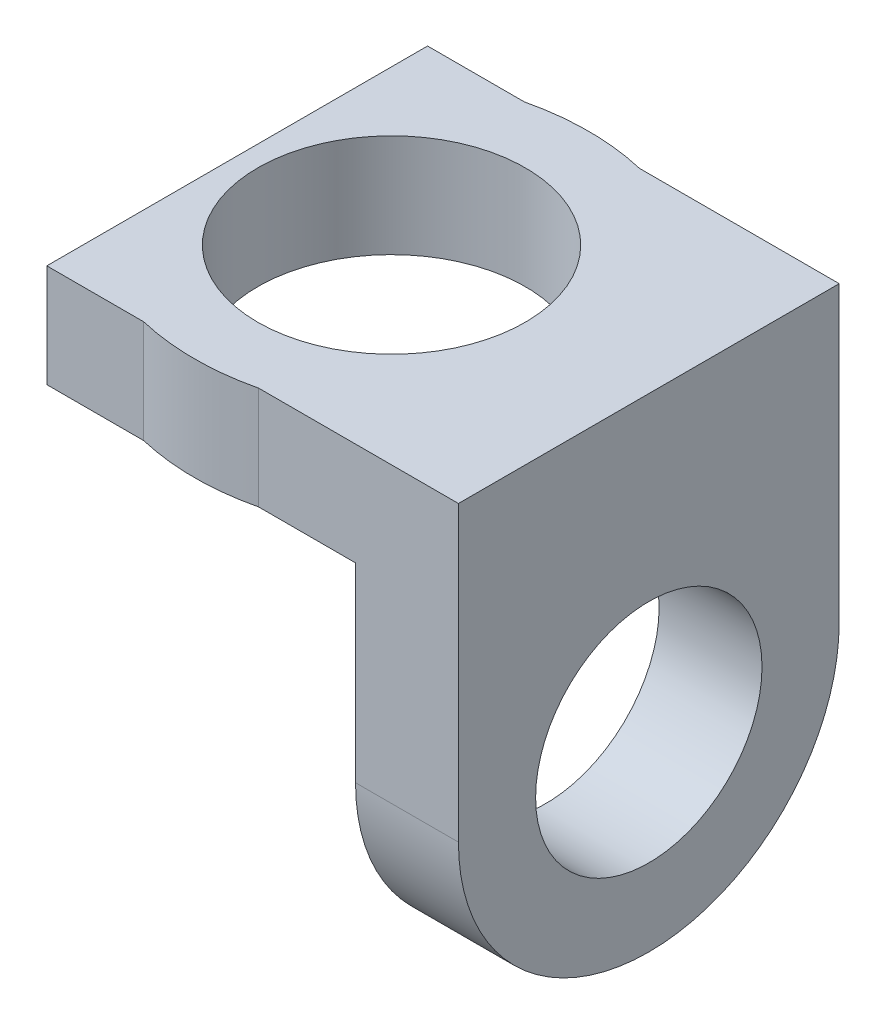
ISO-10303-21;
HEADER;
FILE_DESCRIPTION(('STEP AP214'),'2;1');
FILE_NAME('part.step','',(''),(''),'','','');
FILE_SCHEMA(('AUTOMOTIVE_DESIGN { 1 0 10303 214 1 1 1 1 }'));
ENDSEC;
DATA;
#1=APPLICATION_CONTEXT('core data for automotive mechanical design processes');
#2=APPLICATION_PROTOCOL_DEFINITION('international standard','automotive_design',2000,#1);
#3=PRODUCT_CONTEXT('',#1,'mechanical');
#4=PRODUCT('Part','Part','',(#3));
#5=PRODUCT_RELATED_PRODUCT_CATEGORY('part','',(#4));
#6=PRODUCT_DEFINITION_FORMATION('','',#4);
#7=PRODUCT_DEFINITION_CONTEXT('part definition',#1,'design');
#8=PRODUCT_DEFINITION('design','',#6,#7);
#9=PRODUCT_DEFINITION_SHAPE('','',#8);
#10=(LENGTH_UNIT() NAMED_UNIT(*) SI_UNIT(.MILLI.,.METRE.));
#11=(NAMED_UNIT(*) PLANE_ANGLE_UNIT() SI_UNIT($,.RADIAN.));
#12=(NAMED_UNIT(*) SI_UNIT($,.STERADIAN.) SOLID_ANGLE_UNIT());
#13=UNCERTAINTY_MEASURE_WITH_UNIT(LENGTH_MEASURE(1.E-05),#10,'distance_accuracy_value','');
#14=(GEOMETRIC_REPRESENTATION_CONTEXT(3) GLOBAL_UNCERTAINTY_ASSIGNED_CONTEXT((#13)) GLOBAL_UNIT_ASSIGNED_CONTEXT((#10,
#11,#12)) REPRESENTATION_CONTEXT('',''));
#15=CARTESIAN_POINT('',(0.,0.,0.));
#16=DIRECTION('',(0.,0.,1.));
#17=DIRECTION('',(1.,0.,0.));
#18=AXIS2_PLACEMENT_3D('',#15,#16,#17);
#19=CARTESIAN_POINT('',(10.,0.,0.));
#20=DIRECTION('',(-1.,0.,0.));
#21=DIRECTION('',(0.,0.,1.));
#22=AXIS2_PLACEMENT_3D('',#19,#20,#21);
#23=CYLINDRICAL_SURFACE('',#22,18.5);
#24=DIRECTION('',(-1.,0.,0.));
#25=VECTOR('',#24,1.);
#26=CARTESIAN_POINT('',(10.,0.,-18.5));
#27=LINE('',#26,#25);
#28=CARTESIAN_POINT('',(0.,0.,-18.5));
#29=VERTEX_POINT('',#28);
#30=CARTESIAN_POINT('',(10.,0.,-18.5));
#31=VERTEX_POINT('',#30);
#32=EDGE_CURVE('E49',#29,#31,#27,.F.);
#33=ORIENTED_EDGE('',*,*,#32,.T.);
#34=CARTESIAN_POINT('',(10.,0.,0.));
#35=DIRECTION('',(1.,0.,0.));
#36=DIRECTION('',(0.,0.,-1.));
#37=AXIS2_PLACEMENT_3D('',#34,#35,#36);
#38=CIRCLE('',#37,18.5);
#39=CARTESIAN_POINT('',(10.,0.,18.5));
#40=VERTEX_POINT('',#39);
#41=EDGE_CURVE('E11',#40,#31,#38,.T.);
#42=ORIENTED_EDGE('',*,*,#41,.F.);
#43=DIRECTION('',(-1.,0.,0.));
#44=VECTOR('',#43,1.);
#45=CARTESIAN_POINT('',(10.,0.,18.5));
#46=LINE('',#45,#44);
#47=CARTESIAN_POINT('',(0.,0.,18.5));
#48=VERTEX_POINT('',#47);
#49=EDGE_CURVE('E185',#48,#40,#46,.F.);
#50=ORIENTED_EDGE('',*,*,#49,.F.);
#51=CARTESIAN_POINT('',(0.,0.,0.));
#52=DIRECTION('',(1.,0.,0.));
#53=DIRECTION('',(0.,0.,-1.));
#54=AXIS2_PLACEMENT_3D('',#51,#52,#53);
#55=CIRCLE('',#54,18.5);
#56=EDGE_CURVE('E38',#48,#29,#55,.T.);
#57=ORIENTED_EDGE('',*,*,#56,.T.);
#58=EDGE_LOOP('',(#33,#42,#50,#57));
#59=FACE_BOUND('',#58,.T.);
#60=ADVANCED_FACE('F35',(#59),#23,.T.);
#61=CARTESIAN_POINT('',(10.,0.,0.));
#62=DIRECTION('',(1.,0.,0.));
#63=DIRECTION('',(0.,0.,-1.));
#64=AXIS2_PLACEMENT_3D('',#61,#62,#63);
#65=PLANE('',#64);
#66=ORIENTED_EDGE('',*,*,#41,.T.);
#67=DIRECTION('',(0.,1.,0.));
#68=VECTOR('',#67,1.);
#69=CARTESIAN_POINT('',(10.,-18.501,-18.5));
#70=LINE('',#69,#68);
#71=CARTESIAN_POINT('',(10.,28.5,-18.5));
#72=VERTEX_POINT('',#71);
#73=EDGE_CURVE('E120',#31,#72,#70,.T.);
#74=ORIENTED_EDGE('',*,*,#73,.T.);
#75=DIRECTION('',(0.,0.,-1.));
#76=VECTOR('',#75,1.);
#77=CARTESIAN_POINT('',(10.,28.5,0.));
#78=LINE('',#77,#76);
#79=CARTESIAN_POINT('',(10.,28.5,18.5));
#80=VERTEX_POINT('',#79);
#81=EDGE_CURVE('E146',#80,#72,#78,.T.);
#82=ORIENTED_EDGE('',*,*,#81,.F.);
#83=DIRECTION('',(0.,1.,0.));
#84=VECTOR('',#83,1.);
#85=CARTESIAN_POINT('',(10.,-18.501,18.5));
#86=LINE('',#85,#84);
#87=EDGE_CURVE('E188',#40,#80,#86,.T.);
#88=ORIENTED_EDGE('',*,*,#87,.F.);
#89=EDGE_LOOP('',(#66,#74,#82,#88));
#90=FACE_BOUND('',#89,.T.);
#91=CARTESIAN_POINT('',(10.,0.,0.));
#92=DIRECTION('',(1.,0.,0.));
#93=DIRECTION('',(0.,0.,-1.));
#94=AXIS2_PLACEMENT_3D('',#91,#92,#93);
#95=CIRCLE('',#94,11.);
#96=CARTESIAN_POINT('',(10.,0.,-11.));
#97=VERTEX_POINT('',#96);
#98=EDGE_CURVE('E194',#97,#97,#95,.T.);
#99=ORIENTED_EDGE('',*,*,#98,.F.);
#100=EDGE_LOOP('',(#99));
#101=FACE_BOUND('',#100,.T.);
#102=ADVANCED_FACE('F214',(#90,#101),#65,.T.);
#103=CARTESIAN_POINT('',(0.,0.,0.));
#104=DIRECTION('',(1.,0.,0.));
#105=DIRECTION('',(0.,0.,-1.));
#106=AXIS2_PLACEMENT_3D('',#103,#104,#105);
#107=PLANE('',#106);
#108=ORIENTED_EDGE('',*,*,#56,.F.);
#109=DIRECTION('',(0.,1.,0.));
#110=VECTOR('',#109,1.);
#111=CARTESIAN_POINT('',(0.,-18.501,18.5));
#112=LINE('',#111,#110);
#113=CARTESIAN_POINT('',(0.,18.5,18.5));
#114=VERTEX_POINT('',#113);
#115=EDGE_CURVE('E191',#48,#114,#112,.T.);
#116=ORIENTED_EDGE('',*,*,#115,.T.);
#117=DIRECTION('',(0.,0.,1.));
#118=VECTOR('',#117,1.);
#119=CARTESIAN_POINT('',(0.,18.5,0.));
#120=LINE('',#119,#118);
#121=CARTESIAN_POINT('',(0.,18.5,-18.5));
#122=VERTEX_POINT('',#121);
#123=EDGE_CURVE('E184',#122,#114,#120,.T.);
#124=ORIENTED_EDGE('',*,*,#123,.F.);
#125=DIRECTION('',(0.,1.,0.));
#126=VECTOR('',#125,1.);
#127=CARTESIAN_POINT('',(0.,-18.501,-18.5));
#128=LINE('',#127,#126);
#129=EDGE_CURVE('E180',#29,#122,#128,.T.);
#130=ORIENTED_EDGE('',*,*,#129,.F.);
#131=EDGE_LOOP('',(#108,#116,#124,#130));
#132=FACE_BOUND('',#131,.T.);
#133=CARTESIAN_POINT('',(0.,0.,0.));
#134=DIRECTION('',(1.,0.,0.));
#135=DIRECTION('',(0.,0.,-1.));
#136=AXIS2_PLACEMENT_3D('',#133,#134,#135);
#137=CIRCLE('',#136,11.);
#138=CARTESIAN_POINT('',(0.,0.,-11.));
#139=VERTEX_POINT('',#138);
#140=EDGE_CURVE('E187',#139,#139,#137,.T.);
#141=ORIENTED_EDGE('',*,*,#140,.T.);
#142=EDGE_LOOP('',(#141));
#143=FACE_BOUND('',#142,.T.);
#144=ADVANCED_FACE('F200',(#132,#143),#107,.F.);
#145=CARTESIAN_POINT('',(10.,0.,0.));
#146=DIRECTION('',(-1.,0.,0.));
#147=DIRECTION('',(0.,0.,1.));
#148=AXIS2_PLACEMENT_3D('',#145,#146,#147);
#149=CYLINDRICAL_SURFACE('',#148,11.);
#150=ORIENTED_EDGE('',*,*,#98,.T.);
#151=EDGE_LOOP('',(#150));
#152=FACE_BOUND('',#151,.T.);
#153=ORIENTED_EDGE('',*,*,#140,.F.);
#154=EDGE_LOOP('',(#153));
#155=FACE_BOUND('',#154,.T.);
#156=ADVANCED_FACE('F202',(#152,#155),#149,.F.);
#157=CARTESIAN_POINT('',(0.,-18.501,18.5));
#158=DIRECTION('',(0.,0.,-1.));
#159=DIRECTION('',(-1.,0.,0.));
#160=AXIS2_PLACEMENT_3D('',#157,#158,#159);
#161=PLANE('',#160);
#162=ORIENTED_EDGE('',*,*,#115,.F.);
#163=ORIENTED_EDGE('',*,*,#49,.T.);
#164=ORIENTED_EDGE('',*,*,#87,.T.);
#165=DIRECTION('',(-1.,0.,0.));
#166=VECTOR('',#165,1.);
#167=CARTESIAN_POINT('',(0.,28.5,18.5));
#168=LINE('',#167,#166);
#169=CARTESIAN_POINT('',(-9.41198123664819,28.5,18.5));
#170=VERTEX_POINT('',#169);
#171=EDGE_CURVE('E142',#80,#170,#168,.T.);
#172=ORIENTED_EDGE('',*,*,#171,.T.);
#173=DIRECTION('',(0.,-1.,0.));
#174=VECTOR('',#173,1.);
#175=CARTESIAN_POINT('',(-9.41198123664819,28.5,18.5));
#176=LINE('',#175,#174);
#177=CARTESIAN_POINT('',(-9.41198123664819,18.5,18.5));
#178=VERTEX_POINT('',#177);
#179=EDGE_CURVE('E173',#170,#178,#176,.T.);
#180=ORIENTED_EDGE('',*,*,#179,.T.);
#181=DIRECTION('',(-1.,0.,0.));
#182=VECTOR('',#181,1.);
#183=CARTESIAN_POINT('',(0.,18.5,18.5));
#184=LINE('',#183,#182);
#185=EDGE_CURVE('E162',#114,#178,#184,.T.);
#186=ORIENTED_EDGE('',*,*,#185,.F.);
#187=EDGE_LOOP('',(#162,#163,#164,#172,#180,#186));
#188=FACE_BOUND('',#187,.T.);
#189=ADVANCED_FACE('F204',(#188),#161,.F.);
#190=CARTESIAN_POINT('',(0.,-18.501,-18.5));
#191=DIRECTION('',(0.,0.,1.));
#192=DIRECTION('',(1.,0.,0.));
#193=AXIS2_PLACEMENT_3D('',#190,#191,#192);
#194=PLANE('',#193);
#195=ORIENTED_EDGE('',*,*,#32,.F.);
#196=ORIENTED_EDGE('',*,*,#129,.T.);
#197=DIRECTION('',(1.,0.,0.));
#198=VECTOR('',#197,1.);
#199=CARTESIAN_POINT('',(0.,18.5,-18.5));
#200=LINE('',#199,#198);
#201=CARTESIAN_POINT('',(-9.41198123664817,18.5,-18.5));
#202=VERTEX_POINT('',#201);
#203=EDGE_CURVE('E156',#202,#122,#200,.T.);
#204=ORIENTED_EDGE('',*,*,#203,.F.);
#205=DIRECTION('',(0.,-1.,0.));
#206=VECTOR('',#205,1.);
#207=CARTESIAN_POINT('',(-9.41198123664817,28.5,-18.5));
#208=LINE('',#207,#206);
#209=CARTESIAN_POINT('',(-9.41198123664817,28.5,-18.5));
#210=VERTEX_POINT('',#209);
#211=EDGE_CURVE('E171',#210,#202,#208,.T.);
#212=ORIENTED_EDGE('',*,*,#211,.F.);
#213=DIRECTION('',(1.,0.,0.));
#214=VECTOR('',#213,1.);
#215=CARTESIAN_POINT('',(0.,28.5,-18.5));
#216=LINE('',#215,#214);
#217=EDGE_CURVE('E136',#210,#72,#216,.T.);
#218=ORIENTED_EDGE('',*,*,#217,.T.);
#219=ORIENTED_EDGE('',*,*,#73,.F.);
#220=EDGE_LOOP('',(#195,#196,#204,#212,#218,#219));
#221=FACE_BOUND('',#220,.T.);
#222=ADVANCED_FACE('F211',(#221),#194,.F.);
#223=CARTESIAN_POINT('',(0.,18.5,0.));
#224=DIRECTION('',(0.,1.,0.));
#225=DIRECTION('',(0.,0.,1.));
#226=AXIS2_PLACEMENT_3D('',#223,#224,#225);
#227=PLANE('',#226);
#228=CARTESIAN_POINT('',(-15.,18.5,0.));
#229=DIRECTION('',(0.,1.,0.));
#230=DIRECTION('',(0.,0.,1.));
#231=AXIS2_PLACEMENT_3D('',#228,#229,#230);
#232=CIRCLE('',#231,13.);
#233=CARTESIAN_POINT('',(-15.,18.5,13.));
#234=VERTEX_POINT('',#233);
#235=EDGE_CURVE('E134',#234,#234,#232,.T.);
#236=ORIENTED_EDGE('',*,*,#235,.T.);
#237=EDGE_LOOP('',(#236));
#238=FACE_BOUND('',#237,.T.);
#239=ORIENTED_EDGE('',*,*,#203,.T.);
#240=ORIENTED_EDGE('',*,*,#123,.T.);
#241=ORIENTED_EDGE('',*,*,#185,.T.);
#242=CARTESIAN_POINT('',(-15.,18.5,-5.0472547676192));
#243=DIRECTION('',(0.,1.,0.));
#244=DIRECTION('',(0.,0.,1.));
#245=AXIS2_PLACEMENT_3D('',#242,#243,#244);
#246=CIRCLE('',#245,24.201222299519);
#247=CARTESIAN_POINT('',(-20.5880187633518,18.5,18.5));
#248=VERTEX_POINT('',#247);
#249=EDGE_CURVE('E161',#178,#248,#246,.F.);
#250=ORIENTED_EDGE('',*,*,#249,.T.);
#251=CARTESIAN_POINT('',(-30.,18.5,18.5));
#252=VERTEX_POINT('',#251);
#253=EDGE_CURVE('E158',#248,#252,#184,.T.);
#254=ORIENTED_EDGE('',*,*,#253,.T.);
#255=DIRECTION('',(0.,0.,-1.));
#256=VECTOR('',#255,1.);
#257=CARTESIAN_POINT('',(-30.,18.5,0.));
#258=LINE('',#257,#256);
#259=CARTESIAN_POINT('',(-30.,18.5,-18.5));
#260=VERTEX_POINT('',#259);
#261=EDGE_CURVE('E155',#252,#260,#258,.T.);
#262=ORIENTED_EDGE('',*,*,#261,.T.);
#263=CARTESIAN_POINT('',(-20.5880187633518,18.5,-18.5));
#264=VERTEX_POINT('',#263);
#265=EDGE_CURVE('E115',#260,#264,#200,.T.);
#266=ORIENTED_EDGE('',*,*,#265,.T.);
#267=CARTESIAN_POINT('',(-15.,18.5,5.0472547676192));
#268=DIRECTION('',(0.,1.,0.));
#269=DIRECTION('',(0.,0.,1.));
#270=AXIS2_PLACEMENT_3D('',#267,#268,#269);
#271=CIRCLE('',#270,24.201222299519);
#272=EDGE_CURVE('E165',#202,#264,#271,.T.);
#273=ORIENTED_EDGE('',*,*,#272,.F.);
#274=EDGE_LOOP('',(#239,#240,#241,#250,#254,#262,#266,#273));
#275=FACE_BOUND('',#274,.T.);
#276=ADVANCED_FACE('F240',(#238,#275),#227,.F.);
#277=CARTESIAN_POINT('',(0.,28.5,-18.5));
#278=DIRECTION('',(0.,0.,-1.));
#279=DIRECTION('',(-1.,0.,0.));
#280=AXIS2_PLACEMENT_3D('',#277,#278,#279);
#281=PLANE('',#280);
#282=ORIENTED_EDGE('',*,*,#265,.F.);
#283=DIRECTION('',(0.,-1.,0.));
#284=VECTOR('',#283,1.);
#285=CARTESIAN_POINT('',(-30.,28.5,-18.5));
#286=LINE('',#285,#284);
#287=CARTESIAN_POINT('',(-30.,28.5,-18.5));
#288=VERTEX_POINT('',#287);
#289=EDGE_CURVE('E110',#288,#260,#286,.T.);
#290=ORIENTED_EDGE('',*,*,#289,.F.);
#291=CARTESIAN_POINT('',(-20.5880187633518,28.5,-18.5));
#292=VERTEX_POINT('',#291);
#293=EDGE_CURVE('E113',#288,#292,#216,.T.);
#294=ORIENTED_EDGE('',*,*,#293,.T.);
#295=DIRECTION('',(0.,-1.,0.));
#296=VECTOR('',#295,1.);
#297=CARTESIAN_POINT('',(-20.5880187633518,28.5,-18.5));
#298=LINE('',#297,#296);
#299=EDGE_CURVE('E153',#292,#264,#298,.T.);
#300=ORIENTED_EDGE('',*,*,#299,.T.);
#301=EDGE_LOOP('',(#282,#290,#294,#300));
#302=FACE_BOUND('',#301,.T.);
#303=ADVANCED_FACE('F112',(#302),#281,.T.);
#304=CARTESIAN_POINT('',(-30.,28.5,0.));
#305=DIRECTION('',(-1.,0.,0.));
#306=DIRECTION('',(0.,0.,1.));
#307=AXIS2_PLACEMENT_3D('',#304,#305,#306);
#308=PLANE('',#307);
#309=ORIENTED_EDGE('',*,*,#261,.F.);
#310=DIRECTION('',(0.,-1.,0.));
#311=VECTOR('',#310,1.);
#312=CARTESIAN_POINT('',(-30.,28.5,18.5));
#313=LINE('',#312,#311);
#314=CARTESIAN_POINT('',(-30.,28.5,18.5));
#315=VERTEX_POINT('',#314);
#316=EDGE_CURVE('E121',#315,#252,#313,.T.);
#317=ORIENTED_EDGE('',*,*,#316,.F.);
#318=DIRECTION('',(0.,0.,-1.));
#319=VECTOR('',#318,1.);
#320=CARTESIAN_POINT('',(-30.,28.5,0.));
#321=LINE('',#320,#319);
#322=EDGE_CURVE('E128',#315,#288,#321,.T.);
#323=ORIENTED_EDGE('',*,*,#322,.T.);
#324=ORIENTED_EDGE('',*,*,#289,.T.);
#325=EDGE_LOOP('',(#309,#317,#323,#324));
#326=FACE_BOUND('',#325,.T.);
#327=ADVANCED_FACE('F137',(#326),#308,.T.);
#328=CARTESIAN_POINT('',(0.,28.5,18.5));
#329=DIRECTION('',(0.,0.,1.));
#330=DIRECTION('',(1.,0.,0.));
#331=AXIS2_PLACEMENT_3D('',#328,#329,#330);
#332=PLANE('',#331);
#333=ORIENTED_EDGE('',*,*,#253,.F.);
#334=DIRECTION('',(0.,-1.,0.));
#335=VECTOR('',#334,1.);
#336=CARTESIAN_POINT('',(-20.5880187633518,28.5,18.5));
#337=LINE('',#336,#335);
#338=CARTESIAN_POINT('',(-20.5880187633518,28.5,18.5));
#339=VERTEX_POINT('',#338);
#340=EDGE_CURVE('E176',#339,#248,#337,.T.);
#341=ORIENTED_EDGE('',*,*,#340,.F.);
#342=EDGE_CURVE('E138',#339,#315,#168,.T.);
#343=ORIENTED_EDGE('',*,*,#342,.T.);
#344=ORIENTED_EDGE('',*,*,#316,.T.);
#345=EDGE_LOOP('',(#333,#341,#343,#344));
#346=FACE_BOUND('',#345,.T.);
#347=ADVANCED_FACE('F245',(#346),#332,.T.);
#348=CARTESIAN_POINT('',(-15.,28.5,-5.0472547676192));
#349=DIRECTION('',(0.,-1.,0.));
#350=DIRECTION('',(0.,0.,-1.));
#351=AXIS2_PLACEMENT_3D('',#348,#349,#350);
#352=CYLINDRICAL_SURFACE('',#351,24.201222299519);
#353=ORIENTED_EDGE('',*,*,#249,.F.);
#354=ORIENTED_EDGE('',*,*,#179,.F.);
#355=CARTESIAN_POINT('',(-15.,28.5,-5.0472547676192));
#356=DIRECTION('',(0.,1.,0.));
#357=DIRECTION('',(0.,0.,1.));
#358=AXIS2_PLACEMENT_3D('',#355,#356,#357);
#359=CIRCLE('',#358,24.201222299519);
#360=EDGE_CURVE('E140',#170,#339,#359,.F.);
#361=ORIENTED_EDGE('',*,*,#360,.T.);
#362=ORIENTED_EDGE('',*,*,#340,.T.);
#363=EDGE_LOOP('',(#353,#354,#361,#362));
#364=FACE_BOUND('',#363,.T.);
#365=ADVANCED_FACE('F243',(#364),#352,.T.);
#366=CARTESIAN_POINT('',(-15.,28.5,5.0472547676192));
#367=DIRECTION('',(0.,-1.,0.));
#368=DIRECTION('',(0.,0.,-1.));
#369=AXIS2_PLACEMENT_3D('',#366,#367,#368);
#370=CYLINDRICAL_SURFACE('',#369,24.201222299519);
#371=ORIENTED_EDGE('',*,*,#272,.T.);
#372=ORIENTED_EDGE('',*,*,#299,.F.);
#373=CARTESIAN_POINT('',(-15.,28.5,5.0472547676192));
#374=DIRECTION('',(0.,1.,0.));
#375=DIRECTION('',(0.,0.,1.));
#376=AXIS2_PLACEMENT_3D('',#373,#374,#375);
#377=CIRCLE('',#376,24.201222299519);
#378=EDGE_CURVE('E132',#210,#292,#377,.T.);
#379=ORIENTED_EDGE('',*,*,#378,.F.);
#380=ORIENTED_EDGE('',*,*,#211,.T.);
#381=EDGE_LOOP('',(#371,#372,#379,#380));
#382=FACE_BOUND('',#381,.T.);
#383=ADVANCED_FACE('F252',(#382),#370,.T.);
#384=CARTESIAN_POINT('',(-15.,28.5,0.));
#385=DIRECTION('',(0.,-1.,0.));
#386=DIRECTION('',(0.,0.,-1.));
#387=AXIS2_PLACEMENT_3D('',#384,#385,#386);
#388=CYLINDRICAL_SURFACE('',#387,13.);
#389=CARTESIAN_POINT('',(-15.,28.5,0.));
#390=DIRECTION('',(0.,1.,0.));
#391=DIRECTION('',(0.,0.,1.));
#392=AXIS2_PLACEMENT_3D('',#389,#390,#391);
#393=CIRCLE('',#392,13.);
#394=CARTESIAN_POINT('',(-15.,28.5,13.));
#395=VERTEX_POINT('',#394);
#396=EDGE_CURVE('E150',#395,#395,#393,.T.);
#397=ORIENTED_EDGE('',*,*,#396,.T.);
#398=EDGE_LOOP('',(#397));
#399=FACE_BOUND('',#398,.T.);
#400=ORIENTED_EDGE('',*,*,#235,.F.);
#401=EDGE_LOOP('',(#400));
#402=FACE_BOUND('',#401,.T.);
#403=ADVANCED_FACE('F269',(#399,#402),#388,.F.);
#404=CARTESIAN_POINT('',(0.,28.5,0.));
#405=DIRECTION('',(0.,1.,0.));
#406=DIRECTION('',(0.,0.,1.));
#407=AXIS2_PLACEMENT_3D('',#404,#405,#406);
#408=PLANE('',#407);
#409=ORIENTED_EDGE('',*,*,#293,.F.);
#410=ORIENTED_EDGE('',*,*,#322,.F.);
#411=ORIENTED_EDGE('',*,*,#342,.F.);
#412=ORIENTED_EDGE('',*,*,#360,.F.);
#413=ORIENTED_EDGE('',*,*,#171,.F.);
#414=ORIENTED_EDGE('',*,*,#81,.T.);
#415=ORIENTED_EDGE('',*,*,#217,.F.);
#416=ORIENTED_EDGE('',*,*,#378,.T.);
#417=EDGE_LOOP('',(#409,#410,#411,#412,#413,#414,#415,#416));
#418=FACE_BOUND('',#417,.T.);
#419=ORIENTED_EDGE('',*,*,#396,.F.);
#420=EDGE_LOOP('',(#419));
#421=FACE_BOUND('',#420,.T.);
#422=ADVANCED_FACE('F125',(#418,#421),#408,.T.);
#423=CLOSED_SHELL('',(#60,#102,#144,#156,#189,#222,#276,#303,#327,#347,#365,#383,#403,#422));
#424=MANIFOLD_SOLID_BREP('B2',#423);
#425=ADVANCED_BREP_SHAPE_REPRESENTATION('',(#18,#424),#14);
#426=SHAPE_DEFINITION_REPRESENTATION(#9,#425);
ENDSEC;
END-ISO-10303-21;
